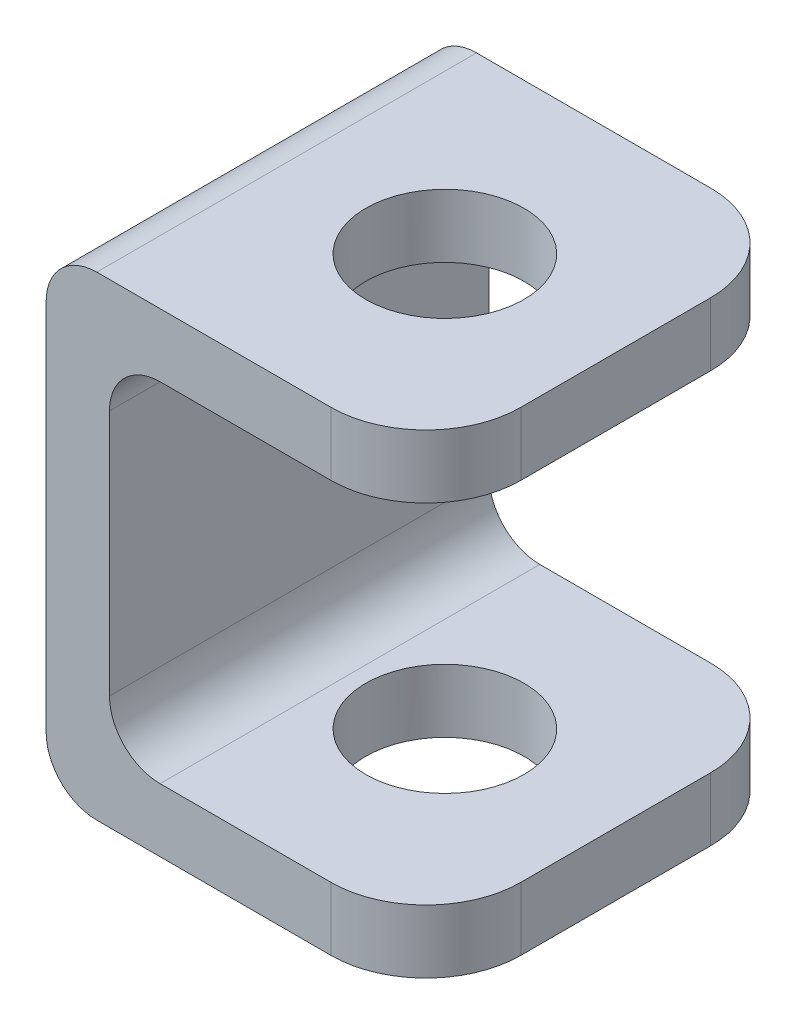
ISO-10303-21;
HEADER;
FILE_DESCRIPTION(('STEP AP214'),'2;1');
FILE_NAME('part.step','',(''),(''),'','','');
FILE_SCHEMA(('AUTOMOTIVE_DESIGN { 1 0 10303 214 1 1 1 1 }'));
ENDSEC;
DATA;
#1=APPLICATION_CONTEXT('core data for automotive mechanical design processes');
#2=APPLICATION_PROTOCOL_DEFINITION('international standard','automotive_design',2000,#1);
#3=PRODUCT_CONTEXT('',#1,'mechanical');
#4=PRODUCT('Part','Part','',(#3));
#5=PRODUCT_RELATED_PRODUCT_CATEGORY('part','',(#4));
#6=PRODUCT_DEFINITION_FORMATION('','',#4);
#7=PRODUCT_DEFINITION_CONTEXT('part definition',#1,'design');
#8=PRODUCT_DEFINITION('design','',#6,#7);
#9=PRODUCT_DEFINITION_SHAPE('','',#8);
#10=(LENGTH_UNIT() NAMED_UNIT(*) SI_UNIT(.MILLI.,.METRE.));
#11=(NAMED_UNIT(*) PLANE_ANGLE_UNIT() SI_UNIT($,.RADIAN.));
#12=(NAMED_UNIT(*) SI_UNIT($,.STERADIAN.) SOLID_ANGLE_UNIT());
#13=UNCERTAINTY_MEASURE_WITH_UNIT(LENGTH_MEASURE(1.E-05),#10,'distance_accuracy_value','');
#14=(GEOMETRIC_REPRESENTATION_CONTEXT(3) GLOBAL_UNCERTAINTY_ASSIGNED_CONTEXT((#13)) GLOBAL_UNIT_ASSIGNED_CONTEXT((#10,
#11,#12)) REPRESENTATION_CONTEXT('',''));
#15=CARTESIAN_POINT('',(0.,0.,0.));
#16=DIRECTION('',(0.,0.,1.));
#17=DIRECTION('',(1.,0.,0.));
#18=AXIS2_PLACEMENT_3D('',#15,#16,#17);
#19=CARTESIAN_POINT('',(0.,37.5,60.));
#20=DIRECTION('',(0.,-1.,0.));
#21=DIRECTION('',(0.,0.,-1.));
#22=AXIS2_PLACEMENT_3D('',#19,#20,#21);
#23=PLANE('',#22);
#24=CARTESIAN_POINT('',(33.,37.5,30.));
#25=DIRECTION('',(0.,1.,0.));
#26=DIRECTION('',(0.,0.,1.));
#27=AXIS2_PLACEMENT_3D('',#24,#25,#26);
#28=CIRCLE('',#27,12.5);
#29=CARTESIAN_POINT('',(33.,37.5,42.5));
#30=VERTEX_POINT('',#29);
#31=EDGE_CURVE('E223',#30,#30,#28,.T.);
#32=ORIENTED_EDGE('',*,*,#31,.F.);
#33=EDGE_LOOP('',(#32));
#34=FACE_BOUND('',#33,.T.);
#35=DIRECTION('',(-1.,0.,0.));
#36=VECTOR('',#35,1.);
#37=CARTESIAN_POINT('',(0.,37.5,0.));
#38=LINE('',#37,#36);
#39=CARTESIAN_POINT('',(45.,37.5,0.));
#40=VERTEX_POINT('',#39);
#41=CARTESIAN_POINT('',(8.,37.5,0.));
#42=VERTEX_POINT('',#41);
#43=EDGE_CURVE('E240',#40,#42,#38,.T.);
#44=ORIENTED_EDGE('',*,*,#43,.T.);
#45=DIRECTION('',(0.,0.,-1.));
#46=VECTOR('',#45,1.);
#47=CARTESIAN_POINT('',(8.,37.5,60.));
#48=LINE('',#47,#46);
#49=CARTESIAN_POINT('',(8.,37.5,60.));
#50=VERTEX_POINT('',#49);
#51=EDGE_CURVE('E63',#42,#50,#48,.F.);
#52=ORIENTED_EDGE('',*,*,#51,.T.);
#53=DIRECTION('',(-1.,0.,0.));
#54=VECTOR('',#53,1.);
#55=CARTESIAN_POINT('',(0.,37.5,60.));
#56=LINE('',#55,#54);
#57=CARTESIAN_POINT('',(45.,37.5,60.));
#58=VERTEX_POINT('',#57);
#59=EDGE_CURVE('E241',#58,#50,#56,.T.);
#60=ORIENTED_EDGE('',*,*,#59,.F.);
#61=CARTESIAN_POINT('',(45.,37.5,45.));
#62=DIRECTION('',(0.,-1.,0.));
#63=DIRECTION('',(0.,0.,-1.));
#64=AXIS2_PLACEMENT_3D('',#61,#62,#63);
#65=CIRCLE('',#64,15.);
#66=CARTESIAN_POINT('',(60.,37.5,45.));
#67=VERTEX_POINT('',#66);
#68=EDGE_CURVE('E341',#58,#67,#65,.F.);
#69=ORIENTED_EDGE('',*,*,#68,.T.);
#70=DIRECTION('',(0.,0.,-1.));
#71=VECTOR('',#70,1.);
#72=CARTESIAN_POINT('',(60.,37.5,60.));
#73=LINE('',#72,#71);
#74=CARTESIAN_POINT('',(60.,37.5,15.));
#75=VERTEX_POINT('',#74);
#76=EDGE_CURVE('E263',#67,#75,#73,.T.);
#77=ORIENTED_EDGE('',*,*,#76,.T.);
#78=CARTESIAN_POINT('',(45.,37.5,15.));
#79=DIRECTION('',(0.,-1.,0.));
#80=DIRECTION('',(0.,0.,-1.));
#81=AXIS2_PLACEMENT_3D('',#78,#79,#80);
#82=CIRCLE('',#81,15.);
#83=EDGE_CURVE('E344',#75,#40,#82,.F.);
#84=ORIENTED_EDGE('',*,*,#83,.T.);
#85=EDGE_LOOP('',(#44,#52,#60,#69,#77,#84));
#86=FACE_BOUND('',#85,.T.);
#87=ADVANCED_FACE('F38',(#34,#86),#23,.F.);
#88=CARTESIAN_POINT('',(0.,-37.5,60.));
#89=DIRECTION('',(1.,0.,0.));
#90=DIRECTION('',(0.,0.,-1.));
#91=AXIS2_PLACEMENT_3D('',#88,#89,#90);
#92=PLANE('',#91);
#93=DIRECTION('',(0.,0.,-1.));
#94=VECTOR('',#93,1.);
#95=CARTESIAN_POINT('',(0.,12.7,17.3));
#96=LINE('',#95,#94);
#97=CARTESIAN_POINT('',(0.,12.7,42.7));
#98=VERTEX_POINT('',#97);
#99=CARTESIAN_POINT('',(0.,12.7,17.3));
#100=VERTEX_POINT('',#99);
#101=EDGE_CURVE('E214',#98,#100,#96,.T.);
#102=ORIENTED_EDGE('',*,*,#101,.F.);
#103=DIRECTION('',(0.,1.,0.));
#104=VECTOR('',#103,1.);
#105=CARTESIAN_POINT('',(0.,12.7,42.7));
#106=LINE('',#105,#104);
#107=CARTESIAN_POINT('',(0.,-12.7,42.7));
#108=VERTEX_POINT('',#107);
#109=EDGE_CURVE('E55',#108,#98,#106,.T.);
#110=ORIENTED_EDGE('',*,*,#109,.F.);
#111=DIRECTION('',(0.,0.,1.));
#112=VECTOR('',#111,1.);
#113=CARTESIAN_POINT('',(0.,-12.7,17.3));
#114=LINE('',#113,#112);
#115=CARTESIAN_POINT('',(0.,-12.7,17.3));
#116=VERTEX_POINT('',#115);
#117=EDGE_CURVE('E201',#116,#108,#114,.T.);
#118=ORIENTED_EDGE('',*,*,#117,.F.);
#119=DIRECTION('',(0.,-1.,0.));
#120=VECTOR('',#119,1.);
#121=CARTESIAN_POINT('',(0.,12.7,17.3));
#122=LINE('',#121,#120);
#123=EDGE_CURVE('E205',#100,#116,#122,.T.);
#124=ORIENTED_EDGE('',*,*,#123,.F.);
#125=EDGE_LOOP('',(#102,#110,#118,#124));
#126=FACE_BOUND('',#125,.T.);
#127=DIRECTION('',(0.,-1.,0.));
#128=VECTOR('',#127,1.);
#129=CARTESIAN_POINT('',(0.,-37.5,0.));
#130=LINE('',#129,#128);
#131=CARTESIAN_POINT('',(0.,29.5,0.));
#132=VERTEX_POINT('',#131);
#133=CARTESIAN_POINT('',(0.,-29.5,0.));
#134=VERTEX_POINT('',#133);
#135=EDGE_CURVE('E266',#132,#134,#130,.T.);
#136=ORIENTED_EDGE('',*,*,#135,.T.);
#137=DIRECTION('',(0.,0.,-1.));
#138=VECTOR('',#137,1.);
#139=CARTESIAN_POINT('',(0.,-29.5,60.));
#140=LINE('',#139,#138);
#141=CARTESIAN_POINT('',(0.,-29.5,60.));
#142=VERTEX_POINT('',#141);
#143=EDGE_CURVE('E382',#134,#142,#140,.F.);
#144=ORIENTED_EDGE('',*,*,#143,.T.);
#145=DIRECTION('',(0.,-1.,0.));
#146=VECTOR('',#145,1.);
#147=CARTESIAN_POINT('',(0.,-37.5,60.));
#148=LINE('',#147,#146);
#149=CARTESIAN_POINT('',(0.,29.5,60.));
#150=VERTEX_POINT('',#149);
#151=EDGE_CURVE('E244',#150,#142,#148,.T.);
#152=ORIENTED_EDGE('',*,*,#151,.F.);
#153=DIRECTION('',(0.,0.,-1.));
#154=VECTOR('',#153,1.);
#155=CARTESIAN_POINT('',(0.,29.5,60.));
#156=LINE('',#155,#154);
#157=EDGE_CURVE('E378',#150,#132,#156,.T.);
#158=ORIENTED_EDGE('',*,*,#157,.T.);
#159=EDGE_LOOP('',(#136,#144,#152,#158));
#160=FACE_BOUND('',#159,.T.);
#161=ADVANCED_FACE('F449',(#126,#160),#92,.F.);
#162=CARTESIAN_POINT('',(0.,-37.5,60.));
#163=DIRECTION('',(0.,1.,0.));
#164=DIRECTION('',(0.,0.,1.));
#165=AXIS2_PLACEMENT_3D('',#162,#163,#164);
#166=PLANE('',#165);
#167=CARTESIAN_POINT('',(33.,-37.5,30.));
#168=DIRECTION('',(0.,1.,0.));
#169=DIRECTION('',(0.,0.,1.));
#170=AXIS2_PLACEMENT_3D('',#167,#168,#169);
#171=CIRCLE('',#170,12.5);
#172=CARTESIAN_POINT('',(33.,-37.5,42.5));
#173=VERTEX_POINT('',#172);
#174=EDGE_CURVE('E236',#173,#173,#171,.T.);
#175=ORIENTED_EDGE('',*,*,#174,.T.);
#176=EDGE_LOOP('',(#175));
#177=FACE_BOUND('',#176,.T.);
#178=DIRECTION('',(1.,0.,0.));
#179=VECTOR('',#178,1.);
#180=CARTESIAN_POINT('',(0.,-37.5,60.));
#181=LINE('',#180,#179);
#182=CARTESIAN_POINT('',(8.,-37.5,60.));
#183=VERTEX_POINT('',#182);
#184=CARTESIAN_POINT('',(45.,-37.5,60.));
#185=VERTEX_POINT('',#184);
#186=EDGE_CURVE('E249',#183,#185,#181,.T.);
#187=ORIENTED_EDGE('',*,*,#186,.F.);
#188=DIRECTION('',(0.,0.,-1.));
#189=VECTOR('',#188,1.);
#190=CARTESIAN_POINT('',(8.,-37.5,60.));
#191=LINE('',#190,#189);
#192=CARTESIAN_POINT('',(8.,-37.5,0.));
#193=VERTEX_POINT('',#192);
#194=EDGE_CURVE('E368',#183,#193,#191,.T.);
#195=ORIENTED_EDGE('',*,*,#194,.T.);
#196=DIRECTION('',(1.,0.,0.));
#197=VECTOR('',#196,1.);
#198=CARTESIAN_POINT('',(0.,-37.5,0.));
#199=LINE('',#198,#197);
#200=CARTESIAN_POINT('',(45.,-37.5,0.));
#201=VERTEX_POINT('',#200);
#202=EDGE_CURVE('E270',#193,#201,#199,.T.);
#203=ORIENTED_EDGE('',*,*,#202,.T.);
#204=CARTESIAN_POINT('',(45.,-37.5,15.));
#205=DIRECTION('',(0.,1.,0.));
#206=DIRECTION('',(0.,0.,1.));
#207=AXIS2_PLACEMENT_3D('',#204,#205,#206);
#208=CIRCLE('',#207,15.);
#209=CARTESIAN_POINT('',(60.,-37.5,15.));
#210=VERTEX_POINT('',#209);
#211=EDGE_CURVE('E319',#201,#210,#208,.F.);
#212=ORIENTED_EDGE('',*,*,#211,.T.);
#213=DIRECTION('',(0.,0.,-1.));
#214=VECTOR('',#213,1.);
#215=CARTESIAN_POINT('',(60.,-37.5,60.));
#216=LINE('',#215,#214);
#217=CARTESIAN_POINT('',(60.,-37.5,45.));
#218=VERTEX_POINT('',#217);
#219=EDGE_CURVE('E294',#218,#210,#216,.T.);
#220=ORIENTED_EDGE('',*,*,#219,.F.);
#221=CARTESIAN_POINT('',(45.,-37.5,45.));
#222=DIRECTION('',(0.,1.,0.));
#223=DIRECTION('',(0.,0.,1.));
#224=AXIS2_PLACEMENT_3D('',#221,#222,#223);
#225=CIRCLE('',#224,15.);
#226=EDGE_CURVE('E322',#218,#185,#225,.F.);
#227=ORIENTED_EDGE('',*,*,#226,.T.);
#228=EDGE_LOOP('',(#187,#195,#203,#212,#220,#227));
#229=FACE_BOUND('',#228,.T.);
#230=ADVANCED_FACE('F457',(#177,#229),#166,.F.);
#231=CARTESIAN_POINT('',(60.,-37.5,60.));
#232=DIRECTION('',(-1.,0.,0.));
#233=DIRECTION('',(0.,-1.,0.));
#234=AXIS2_PLACEMENT_3D('',#231,#232,#233);
#235=PLANE('',#234);
#236=DIRECTION('',(0.,0.,-1.));
#237=VECTOR('',#236,1.);
#238=CARTESIAN_POINT('',(60.,-27.5,60.));
#239=LINE('',#238,#237);
#240=CARTESIAN_POINT('',(60.,-27.5,45.));
#241=VERTEX_POINT('',#240);
#242=CARTESIAN_POINT('',(60.,-27.5,15.));
#243=VERTEX_POINT('',#242);
#244=EDGE_CURVE('E290',#241,#243,#239,.T.);
#245=ORIENTED_EDGE('',*,*,#244,.F.);
#246=DIRECTION('',(0.,1.,0.));
#247=VECTOR('',#246,1.);
#248=CARTESIAN_POINT('',(60.,-37.5,45.));
#249=LINE('',#248,#247);
#250=EDGE_CURVE('E316',#241,#218,#249,.F.);
#251=ORIENTED_EDGE('',*,*,#250,.T.);
#252=ORIENTED_EDGE('',*,*,#219,.T.);
#253=DIRECTION('',(0.,1.,0.));
#254=VECTOR('',#253,1.);
#255=CARTESIAN_POINT('',(60.,-27.5,15.));
#256=LINE('',#255,#254);
#257=EDGE_CURVE('E312',#210,#243,#256,.T.);
#258=ORIENTED_EDGE('',*,*,#257,.T.);
#259=EDGE_LOOP('',(#245,#251,#252,#258));
#260=FACE_BOUND('',#259,.T.);
#261=ADVANCED_FACE('F466',(#260),#235,.F.);
#262=CARTESIAN_POINT('',(60.,-27.5,60.));
#263=DIRECTION('',(0.,-1.,0.));
#264=DIRECTION('',(1.,0.,0.));
#265=AXIS2_PLACEMENT_3D('',#262,#263,#264);
#266=PLANE('',#265);
#267=CARTESIAN_POINT('',(33.,-27.5,30.));
#268=DIRECTION('',(0.,-1.,0.));
#269=DIRECTION('',(1.,0.,0.));
#270=AXIS2_PLACEMENT_3D('',#267,#268,#269);
#271=CIRCLE('',#270,12.5);
#272=CARTESIAN_POINT('',(45.5,-27.5,30.));
#273=VERTEX_POINT('',#272);
#274=EDGE_CURVE('E232',#273,#273,#271,.T.);
#275=ORIENTED_EDGE('',*,*,#274,.T.);
#276=EDGE_LOOP('',(#275));
#277=FACE_BOUND('',#276,.T.);
#278=DIRECTION('',(-1.,0.,0.));
#279=VECTOR('',#278,1.);
#280=CARTESIAN_POINT('',(60.,-27.5,0.));
#281=LINE('',#280,#279);
#282=CARTESIAN_POINT('',(45.,-27.5,0.));
#283=VERTEX_POINT('',#282);
#284=CARTESIAN_POINT('',(18.,-27.5,0.));
#285=VERTEX_POINT('',#284);
#286=EDGE_CURVE('E273',#283,#285,#281,.T.);
#287=ORIENTED_EDGE('',*,*,#286,.T.);
#288=DIRECTION('',(0.,0.,-1.));
#289=VECTOR('',#288,1.);
#290=CARTESIAN_POINT('',(18.,-27.5,60.));
#291=LINE('',#290,#289);
#292=CARTESIAN_POINT('',(18.,-27.5,60.));
#293=VERTEX_POINT('',#292);
#294=EDGE_CURVE('E365',#285,#293,#291,.F.);
#295=ORIENTED_EDGE('',*,*,#294,.T.);
#296=DIRECTION('',(-1.,0.,0.));
#297=VECTOR('',#296,1.);
#298=CARTESIAN_POINT('',(60.,-27.5,60.));
#299=LINE('',#298,#297);
#300=CARTESIAN_POINT('',(45.,-27.5,60.));
#301=VERTEX_POINT('',#300);
#302=EDGE_CURVE('E252',#301,#293,#299,.T.);
#303=ORIENTED_EDGE('',*,*,#302,.F.);
#304=CARTESIAN_POINT('',(45.,-27.5,45.));
#305=DIRECTION('',(0.,-1.,0.));
#306=DIRECTION('',(1.,0.,0.));
#307=AXIS2_PLACEMENT_3D('',#304,#305,#306);
#308=CIRCLE('',#307,15.);
#309=EDGE_CURVE('E309',#301,#241,#308,.F.);
#310=ORIENTED_EDGE('',*,*,#309,.T.);
#311=ORIENTED_EDGE('',*,*,#244,.T.);
#312=CARTESIAN_POINT('',(45.,-27.5,15.));
#313=DIRECTION('',(0.,-1.,0.));
#314=DIRECTION('',(1.,0.,0.));
#315=AXIS2_PLACEMENT_3D('',#312,#313,#314);
#316=CIRCLE('',#315,15.);
#317=EDGE_CURVE('E306',#243,#283,#316,.F.);
#318=ORIENTED_EDGE('',*,*,#317,.T.);
#319=EDGE_LOOP('',(#287,#295,#303,#310,#311,#318));
#320=FACE_BOUND('',#319,.T.);
#321=ADVANCED_FACE('F410',(#277,#320),#266,.F.);
#322=CARTESIAN_POINT('',(10.,27.5,60.));
#323=DIRECTION('',(-1.,0.,0.));
#324=DIRECTION('',(0.,0.,1.));
#325=AXIS2_PLACEMENT_3D('',#322,#323,#324);
#326=PLANE('',#325);
#327=DIRECTION('',(0.,1.,0.));
#328=VECTOR('',#327,1.);
#329=CARTESIAN_POINT('',(10.,27.5,0.));
#330=LINE('',#329,#328);
#331=CARTESIAN_POINT('',(10.,-19.5,0.));
#332=VERTEX_POINT('',#331);
#333=CARTESIAN_POINT('',(10.,19.5,0.));
#334=VERTEX_POINT('',#333);
#335=EDGE_CURVE('E277',#332,#334,#330,.T.);
#336=ORIENTED_EDGE('',*,*,#335,.T.);
#337=DIRECTION('',(0.,0.,-1.));
#338=VECTOR('',#337,1.);
#339=CARTESIAN_POINT('',(10.,19.5,60.));
#340=LINE('',#339,#338);
#341=CARTESIAN_POINT('',(10.,19.5,60.));
#342=VERTEX_POINT('',#341);
#343=EDGE_CURVE('E362',#334,#342,#340,.F.);
#344=ORIENTED_EDGE('',*,*,#343,.T.);
#345=DIRECTION('',(0.,1.,0.));
#346=VECTOR('',#345,1.);
#347=CARTESIAN_POINT('',(10.,27.5,60.));
#348=LINE('',#347,#346);
#349=CARTESIAN_POINT('',(10.,-19.5,60.));
#350=VERTEX_POINT('',#349);
#351=EDGE_CURVE('E256',#350,#342,#348,.T.);
#352=ORIENTED_EDGE('',*,*,#351,.F.);
#353=DIRECTION('',(0.,0.,-1.));
#354=VECTOR('',#353,1.);
#355=CARTESIAN_POINT('',(10.,-19.5,0.));
#356=LINE('',#355,#354);
#357=EDGE_CURVE('E358',#350,#332,#356,.T.);
#358=ORIENTED_EDGE('',*,*,#357,.T.);
#359=EDGE_LOOP('',(#336,#344,#352,#358));
#360=FACE_BOUND('',#359,.T.);
#361=ADVANCED_FACE('F419',(#360),#326,.F.);
#362=CARTESIAN_POINT('',(60.,27.5,60.));
#363=DIRECTION('',(0.,1.,0.));
#364=DIRECTION('',(-1.,0.,0.));
#365=AXIS2_PLACEMENT_3D('',#362,#363,#364);
#366=PLANE('',#365);
#367=CARTESIAN_POINT('',(33.,27.5,30.));
#368=DIRECTION('',(0.,1.,0.));
#369=DIRECTION('',(-1.,0.,0.));
#370=AXIS2_PLACEMENT_3D('',#367,#368,#369);
#371=CIRCLE('',#370,12.5);
#372=CARTESIAN_POINT('',(20.5,27.5,30.));
#373=VERTEX_POINT('',#372);
#374=EDGE_CURVE('E42',#373,#373,#371,.T.);
#375=ORIENTED_EDGE('',*,*,#374,.T.);
#376=EDGE_LOOP('',(#375));
#377=FACE_BOUND('',#376,.T.);
#378=DIRECTION('',(1.,0.,0.));
#379=VECTOR('',#378,1.);
#380=CARTESIAN_POINT('',(60.,27.5,60.));
#381=LINE('',#380,#379);
#382=CARTESIAN_POINT('',(18.,27.5,60.));
#383=VERTEX_POINT('',#382);
#384=CARTESIAN_POINT('',(45.,27.5,60.));
#385=VERTEX_POINT('',#384);
#386=EDGE_CURVE('E260',#383,#385,#381,.T.);
#387=ORIENTED_EDGE('',*,*,#386,.F.);
#388=DIRECTION('',(0.,0.,-1.));
#389=VECTOR('',#388,1.);
#390=CARTESIAN_POINT('',(18.,27.5,0.));
#391=LINE('',#390,#389);
#392=CARTESIAN_POINT('',(18.,27.5,0.));
#393=VERTEX_POINT('',#392);
#394=EDGE_CURVE('E354',#383,#393,#391,.T.);
#395=ORIENTED_EDGE('',*,*,#394,.T.);
#396=DIRECTION('',(1.,0.,0.));
#397=VECTOR('',#396,1.);
#398=CARTESIAN_POINT('',(60.,27.5,0.));
#399=LINE('',#398,#397);
#400=CARTESIAN_POINT('',(45.,27.5,0.));
#401=VERTEX_POINT('',#400);
#402=EDGE_CURVE('E245',#393,#401,#399,.T.);
#403=ORIENTED_EDGE('',*,*,#402,.T.);
#404=CARTESIAN_POINT('',(45.,27.5,15.));
#405=DIRECTION('',(0.,1.,0.));
#406=DIRECTION('',(-1.,0.,0.));
#407=AXIS2_PLACEMENT_3D('',#404,#405,#406);
#408=CIRCLE('',#407,15.);
#409=CARTESIAN_POINT('',(60.,27.5,15.));
#410=VERTEX_POINT('',#409);
#411=EDGE_CURVE('E351',#401,#410,#408,.F.);
#412=ORIENTED_EDGE('',*,*,#411,.T.);
#413=DIRECTION('',(0.,0.,-1.));
#414=VECTOR('',#413,1.);
#415=CARTESIAN_POINT('',(60.,27.5,60.));
#416=LINE('',#415,#414);
#417=CARTESIAN_POINT('',(60.,27.5,45.));
#418=VERTEX_POINT('',#417);
#419=EDGE_CURVE('E286',#418,#410,#416,.T.);
#420=ORIENTED_EDGE('',*,*,#419,.F.);
#421=CARTESIAN_POINT('',(45.,27.5,45.));
#422=DIRECTION('',(0.,1.,0.));
#423=DIRECTION('',(-1.,0.,0.));
#424=AXIS2_PLACEMENT_3D('',#421,#422,#423);
#425=CIRCLE('',#424,15.);
#426=EDGE_CURVE('E347',#418,#385,#425,.F.);
#427=ORIENTED_EDGE('',*,*,#426,.T.);
#428=EDGE_LOOP('',(#387,#395,#403,#412,#420,#427));
#429=FACE_BOUND('',#428,.T.);
#430=ADVANCED_FACE('F426',(#377,#429),#366,.F.);
#431=CARTESIAN_POINT('',(60.,37.5,60.));
#432=DIRECTION('',(-1.,0.,0.));
#433=DIRECTION('',(0.,-1.,0.));
#434=AXIS2_PLACEMENT_3D('',#431,#432,#433);
#435=PLANE('',#434);
#436=ORIENTED_EDGE('',*,*,#419,.T.);
#437=DIRECTION('',(0.,1.,0.));
#438=VECTOR('',#437,1.);
#439=CARTESIAN_POINT('',(60.,37.5,15.));
#440=LINE('',#439,#438);
#441=EDGE_CURVE('E337',#410,#75,#440,.T.);
#442=ORIENTED_EDGE('',*,*,#441,.T.);
#443=ORIENTED_EDGE('',*,*,#76,.F.);
#444=DIRECTION('',(0.,1.,0.));
#445=VECTOR('',#444,1.);
#446=CARTESIAN_POINT('',(60.,37.5,45.));
#447=LINE('',#446,#445);
#448=EDGE_CURVE('E334',#67,#418,#447,.F.);
#449=ORIENTED_EDGE('',*,*,#448,.T.);
#450=EDGE_LOOP('',(#436,#442,#443,#449));
#451=FACE_BOUND('',#450,.T.);
#452=ADVANCED_FACE('F437',(#451),#435,.F.);
#453=CARTESIAN_POINT('',(0.,0.,60.));
#454=DIRECTION('',(0.,0.,-1.));
#455=DIRECTION('',(-1.,0.,0.));
#456=AXIS2_PLACEMENT_3D('',#453,#454,#455);
#457=PLANE('',#456);
#458=ORIENTED_EDGE('',*,*,#151,.T.);
#459=CARTESIAN_POINT('',(8.,-29.5,60.));
#460=DIRECTION('',(0.,0.,-1.));
#461=DIRECTION('',(-1.,0.,0.));
#462=AXIS2_PLACEMENT_3D('',#459,#460,#461);
#463=CIRCLE('',#462,8.);
#464=EDGE_CURVE('E388',#142,#183,#463,.F.);
#465=ORIENTED_EDGE('',*,*,#464,.T.);
#466=ORIENTED_EDGE('',*,*,#186,.T.);
#467=DIRECTION('',(0.,1.,0.));
#468=VECTOR('',#467,1.);
#469=CARTESIAN_POINT('',(45.,0.,60.));
#470=LINE('',#469,#468);
#471=EDGE_CURVE('E302',#185,#301,#470,.T.);
#472=ORIENTED_EDGE('',*,*,#471,.T.);
#473=ORIENTED_EDGE('',*,*,#302,.T.);
#474=CARTESIAN_POINT('',(18.,-19.5,60.));
#475=DIRECTION('',(0.,0.,-1.));
#476=DIRECTION('',(-1.,0.,0.));
#477=AXIS2_PLACEMENT_3D('',#474,#475,#476);
#478=CIRCLE('',#477,8.);
#479=EDGE_CURVE('E11',#293,#350,#478,.T.);
#480=ORIENTED_EDGE('',*,*,#479,.T.);
#481=ORIENTED_EDGE('',*,*,#351,.T.);
#482=CARTESIAN_POINT('',(18.,19.5,60.));
#483=DIRECTION('',(0.,0.,-1.));
#484=DIRECTION('',(-1.,0.,0.));
#485=AXIS2_PLACEMENT_3D('',#482,#483,#484);
#486=CIRCLE('',#485,8.);
#487=EDGE_CURVE('E396',#342,#383,#486,.T.);
#488=ORIENTED_EDGE('',*,*,#487,.T.);
#489=ORIENTED_EDGE('',*,*,#386,.T.);
#490=DIRECTION('',(0.,1.,0.));
#491=VECTOR('',#490,1.);
#492=CARTESIAN_POINT('',(45.,0.,60.));
#493=LINE('',#492,#491);
#494=EDGE_CURVE('E298',#385,#58,#493,.T.);
#495=ORIENTED_EDGE('',*,*,#494,.T.);
#496=ORIENTED_EDGE('',*,*,#59,.T.);
#497=CARTESIAN_POINT('',(8.,29.5,60.));
#498=DIRECTION('',(0.,0.,-1.));
#499=DIRECTION('',(-1.,0.,0.));
#500=AXIS2_PLACEMENT_3D('',#497,#498,#499);
#501=CIRCLE('',#500,8.);
#502=EDGE_CURVE('E385',#50,#150,#501,.F.);
#503=ORIENTED_EDGE('',*,*,#502,.T.);
#504=EDGE_LOOP('',(#458,#465,#466,#472,#473,#480,#481,#488,#489,#495,#496,#503));
#505=FACE_BOUND('',#504,.T.);
#506=ADVANCED_FACE('F416',(#505),#457,.F.);
#507=CARTESIAN_POINT('',(0.,0.,0.));
#508=DIRECTION('',(0.,0.,-1.));
#509=DIRECTION('',(-1.,0.,0.));
#510=AXIS2_PLACEMENT_3D('',#507,#508,#509);
#511=PLANE('',#510);
#512=ORIENTED_EDGE('',*,*,#202,.F.);
#513=CARTESIAN_POINT('',(8.,-29.5,0.));
#514=DIRECTION('',(0.,0.,-1.));
#515=DIRECTION('',(-1.,0.,0.));
#516=AXIS2_PLACEMENT_3D('',#513,#514,#515);
#517=CIRCLE('',#516,8.);
#518=EDGE_CURVE('E375',#193,#134,#517,.T.);
#519=ORIENTED_EDGE('',*,*,#518,.T.);
#520=ORIENTED_EDGE('',*,*,#135,.F.);
#521=CARTESIAN_POINT('',(8.,29.5,0.));
#522=DIRECTION('',(0.,0.,-1.));
#523=DIRECTION('',(-1.,0.,0.));
#524=AXIS2_PLACEMENT_3D('',#521,#522,#523);
#525=CIRCLE('',#524,8.);
#526=EDGE_CURVE('E372',#132,#42,#525,.T.);
#527=ORIENTED_EDGE('',*,*,#526,.T.);
#528=ORIENTED_EDGE('',*,*,#43,.F.);
#529=DIRECTION('',(0.,1.,0.));
#530=VECTOR('',#529,1.);
#531=CARTESIAN_POINT('',(45.,27.5,0.));
#532=LINE('',#531,#530);
#533=EDGE_CURVE('E326',#40,#401,#532,.F.);
#534=ORIENTED_EDGE('',*,*,#533,.T.);
#535=ORIENTED_EDGE('',*,*,#402,.F.);
#536=CARTESIAN_POINT('',(18.,19.5,0.));
#537=DIRECTION('',(0.,0.,-1.));
#538=DIRECTION('',(-1.,0.,0.));
#539=AXIS2_PLACEMENT_3D('',#536,#537,#538);
#540=CIRCLE('',#539,8.);
#541=EDGE_CURVE('E393',#393,#334,#540,.F.);
#542=ORIENTED_EDGE('',*,*,#541,.T.);
#543=ORIENTED_EDGE('',*,*,#335,.F.);
#544=CARTESIAN_POINT('',(18.,-19.5,0.));
#545=DIRECTION('',(0.,0.,-1.));
#546=DIRECTION('',(-1.,0.,0.));
#547=AXIS2_PLACEMENT_3D('',#544,#545,#546);
#548=CIRCLE('',#547,8.);
#549=EDGE_CURVE('E48',#332,#285,#548,.F.);
#550=ORIENTED_EDGE('',*,*,#549,.T.);
#551=ORIENTED_EDGE('',*,*,#286,.F.);
#552=DIRECTION('',(0.,1.,0.));
#553=VECTOR('',#552,1.);
#554=CARTESIAN_POINT('',(45.,-37.5,0.));
#555=LINE('',#554,#553);
#556=EDGE_CURVE('E330',#283,#201,#555,.F.);
#557=ORIENTED_EDGE('',*,*,#556,.T.);
#558=EDGE_LOOP('',(#512,#519,#520,#527,#528,#534,#535,#542,#543,#550,#551,#557));
#559=FACE_BOUND('',#558,.T.);
#560=ADVANCED_FACE('F404',(#559),#511,.T.);
#561=CARTESIAN_POINT('',(45.,0.,45.));
#562=DIRECTION('',(0.,1.,0.));
#563=DIRECTION('',(-1.,0.,0.));
#564=AXIS2_PLACEMENT_3D('',#561,#562,#563);
#565=CYLINDRICAL_SURFACE('',#564,15.);
#566=ORIENTED_EDGE('',*,*,#226,.F.);
#567=ORIENTED_EDGE('',*,*,#250,.F.);
#568=ORIENTED_EDGE('',*,*,#309,.F.);
#569=ORIENTED_EDGE('',*,*,#471,.F.);
#570=EDGE_LOOP('',(#566,#567,#568,#569));
#571=FACE_BOUND('',#570,.T.);
#572=ADVANCED_FACE('F469',(#571),#565,.T.);
#573=CARTESIAN_POINT('',(45.,-37.5,15.));
#574=DIRECTION('',(0.,-1.,0.));
#575=DIRECTION('',(1.,0.,0.));
#576=AXIS2_PLACEMENT_3D('',#573,#574,#575);
#577=CYLINDRICAL_SURFACE('',#576,15.);
#578=ORIENTED_EDGE('',*,*,#211,.F.);
#579=ORIENTED_EDGE('',*,*,#556,.F.);
#580=ORIENTED_EDGE('',*,*,#317,.F.);
#581=ORIENTED_EDGE('',*,*,#257,.F.);
#582=EDGE_LOOP('',(#578,#579,#580,#581));
#583=FACE_BOUND('',#582,.T.);
#584=ADVANCED_FACE('F461',(#583),#577,.T.);
#585=CARTESIAN_POINT('',(45.,37.5,15.));
#586=DIRECTION('',(0.,-1.,0.));
#587=DIRECTION('',(1.,0.,0.));
#588=AXIS2_PLACEMENT_3D('',#585,#586,#587);
#589=CYLINDRICAL_SURFACE('',#588,15.);
#590=ORIENTED_EDGE('',*,*,#411,.F.);
#591=ORIENTED_EDGE('',*,*,#533,.F.);
#592=ORIENTED_EDGE('',*,*,#83,.F.);
#593=ORIENTED_EDGE('',*,*,#441,.F.);
#594=EDGE_LOOP('',(#590,#591,#592,#593));
#595=FACE_BOUND('',#594,.T.);
#596=ADVANCED_FACE('F441',(#595),#589,.T.);
#597=CARTESIAN_POINT('',(45.,0.,45.));
#598=DIRECTION('',(0.,1.,0.));
#599=DIRECTION('',(-1.,0.,0.));
#600=AXIS2_PLACEMENT_3D('',#597,#598,#599);
#601=CYLINDRICAL_SURFACE('',#600,15.);
#602=ORIENTED_EDGE('',*,*,#426,.F.);
#603=ORIENTED_EDGE('',*,*,#448,.F.);
#604=ORIENTED_EDGE('',*,*,#68,.F.);
#605=ORIENTED_EDGE('',*,*,#494,.F.);
#606=EDGE_LOOP('',(#602,#603,#604,#605));
#607=FACE_BOUND('',#606,.T.);
#608=ADVANCED_FACE('F433',(#607),#601,.T.);
#609=CARTESIAN_POINT('',(18.,19.5,60.));
#610=DIRECTION('',(0.,0.,1.));
#611=DIRECTION('',(1.,0.,0.));
#612=AXIS2_PLACEMENT_3D('',#609,#610,#611);
#613=CYLINDRICAL_SURFACE('',#612,8.);
#614=ORIENTED_EDGE('',*,*,#487,.F.);
#615=ORIENTED_EDGE('',*,*,#343,.F.);
#616=ORIENTED_EDGE('',*,*,#541,.F.);
#617=ORIENTED_EDGE('',*,*,#394,.F.);
#618=EDGE_LOOP('',(#614,#615,#616,#617));
#619=FACE_BOUND('',#618,.T.);
#620=ADVANCED_FACE('F422',(#619),#613,.F.);
#621=CARTESIAN_POINT('',(18.,-19.5,60.));
#622=DIRECTION('',(0.,0.,1.));
#623=DIRECTION('',(1.,0.,0.));
#624=AXIS2_PLACEMENT_3D('',#621,#622,#623);
#625=CYLINDRICAL_SURFACE('',#624,8.);
#626=ORIENTED_EDGE('',*,*,#479,.F.);
#627=ORIENTED_EDGE('',*,*,#294,.F.);
#628=ORIENTED_EDGE('',*,*,#549,.F.);
#629=ORIENTED_EDGE('',*,*,#357,.F.);
#630=EDGE_LOOP('',(#626,#627,#628,#629));
#631=FACE_BOUND('',#630,.T.);
#632=ADVANCED_FACE('F413',(#631),#625,.F.);
#633=CARTESIAN_POINT('',(8.,-29.5,60.));
#634=DIRECTION('',(0.,0.,-1.));
#635=DIRECTION('',(-1.,0.,0.));
#636=AXIS2_PLACEMENT_3D('',#633,#634,#635);
#637=CYLINDRICAL_SURFACE('',#636,8.);
#638=ORIENTED_EDGE('',*,*,#464,.F.);
#639=ORIENTED_EDGE('',*,*,#143,.F.);
#640=ORIENTED_EDGE('',*,*,#518,.F.);
#641=ORIENTED_EDGE('',*,*,#194,.F.);
#642=EDGE_LOOP('',(#638,#639,#640,#641));
#643=FACE_BOUND('',#642,.T.);
#644=ADVANCED_FACE('F455',(#643),#637,.T.);
#645=CARTESIAN_POINT('',(8.,29.5,60.));
#646=DIRECTION('',(0.,0.,-1.));
#647=DIRECTION('',(-1.,0.,0.));
#648=AXIS2_PLACEMENT_3D('',#645,#646,#647);
#649=CYLINDRICAL_SURFACE('',#648,8.);
#650=ORIENTED_EDGE('',*,*,#502,.F.);
#651=ORIENTED_EDGE('',*,*,#51,.F.);
#652=ORIENTED_EDGE('',*,*,#526,.F.);
#653=ORIENTED_EDGE('',*,*,#157,.F.);
#654=EDGE_LOOP('',(#650,#651,#652,#653));
#655=FACE_BOUND('',#654,.T.);
#656=ADVANCED_FACE('F40',(#655),#649,.T.);
#657=CARTESIAN_POINT('',(33.,-62.5,30.));
#658=DIRECTION('',(0.,1.,0.));
#659=DIRECTION('',(0.,0.,1.));
#660=AXIS2_PLACEMENT_3D('',#657,#658,#659);
#661=CYLINDRICAL_SURFACE('',#660,12.5);
#662=ORIENTED_EDGE('',*,*,#31,.T.);
#663=EDGE_LOOP('',(#662));
#664=FACE_BOUND('',#663,.T.);
#665=ORIENTED_EDGE('',*,*,#374,.F.);
#666=EDGE_LOOP('',(#665));
#667=FACE_BOUND('',#666,.T.);
#668=ADVANCED_FACE('F509',(#664,#667),#661,.F.);
#669=ORIENTED_EDGE('',*,*,#274,.F.);
#670=EDGE_LOOP('',(#669));
#671=FACE_BOUND('',#670,.T.);
#672=ORIENTED_EDGE('',*,*,#174,.F.);
#673=EDGE_LOOP('',(#672));
#674=FACE_BOUND('',#673,.T.);
#675=ADVANCED_FACE('F506',(#671,#674),#661,.F.);
#676=CARTESIAN_POINT('',(0.1,12.7,42.7));
#677=DIRECTION('',(0.,0.,1.));
#678=DIRECTION('',(0.,-1.,0.));
#679=AXIS2_PLACEMENT_3D('',#676,#677,#678);
#680=PLANE('',#679);
#681=ORIENTED_EDGE('',*,*,#109,.T.);
#682=DIRECTION('',(-1.,0.,0.));
#683=VECTOR('',#682,1.);
#684=CARTESIAN_POINT('',(0.1,12.7,42.7));
#685=LINE('',#684,#683);
#686=CARTESIAN_POINT('',(0.1,12.7,42.7));
#687=VERTEX_POINT('',#686);
#688=EDGE_CURVE('E176',#687,#98,#685,.T.);
#689=ORIENTED_EDGE('',*,*,#688,.F.);
#690=DIRECTION('',(0.,1.,0.));
#691=VECTOR('',#690,1.);
#692=CARTESIAN_POINT('',(0.1,12.7,42.7));
#693=LINE('',#692,#691);
#694=CARTESIAN_POINT('',(0.1,-12.7,42.7));
#695=VERTEX_POINT('',#694);
#696=EDGE_CURVE('E180',#695,#687,#693,.T.);
#697=ORIENTED_EDGE('',*,*,#696,.F.);
#698=DIRECTION('',(-1.,0.,0.));
#699=VECTOR('',#698,1.);
#700=CARTESIAN_POINT('',(0.1,-12.7,42.7));
#701=LINE('',#700,#699);
#702=EDGE_CURVE('E220',#695,#108,#701,.T.);
#703=ORIENTED_EDGE('',*,*,#702,.T.);
#704=EDGE_LOOP('',(#681,#689,#697,#703));
#705=FACE_BOUND('',#704,.T.);
#706=ADVANCED_FACE('F178',(#705),#680,.F.);
#707=CARTESIAN_POINT('',(0.1,-12.7,17.3));
#708=DIRECTION('',(0.,-1.,0.));
#709=DIRECTION('',(0.,0.,-1.));
#710=AXIS2_PLACEMENT_3D('',#707,#708,#709);
#711=PLANE('',#710);
#712=ORIENTED_EDGE('',*,*,#117,.T.);
#713=ORIENTED_EDGE('',*,*,#702,.F.);
#714=DIRECTION('',(0.,0.,1.));
#715=VECTOR('',#714,1.);
#716=CARTESIAN_POINT('',(0.1,-12.7,17.3));
#717=LINE('',#716,#715);
#718=CARTESIAN_POINT('',(0.1,-12.7,17.3));
#719=VERTEX_POINT('',#718);
#720=EDGE_CURVE('E187',#719,#695,#717,.T.);
#721=ORIENTED_EDGE('',*,*,#720,.F.);
#722=DIRECTION('',(-1.,0.,0.));
#723=VECTOR('',#722,1.);
#724=CARTESIAN_POINT('',(0.1,-12.7,17.3));
#725=LINE('',#724,#723);
#726=EDGE_CURVE('E224',#719,#116,#725,.T.);
#727=ORIENTED_EDGE('',*,*,#726,.T.);
#728=EDGE_LOOP('',(#712,#713,#721,#727));
#729=FACE_BOUND('',#728,.T.);
#730=ADVANCED_FACE('F513',(#729),#711,.F.);
#731=CARTESIAN_POINT('',(0.1,12.7,17.3));
#732=DIRECTION('',(0.,0.,-1.));
#733=DIRECTION('',(0.,1.,0.));
#734=AXIS2_PLACEMENT_3D('',#731,#732,#733);
#735=PLANE('',#734);
#736=ORIENTED_EDGE('',*,*,#123,.T.);
#737=ORIENTED_EDGE('',*,*,#726,.F.);
#738=DIRECTION('',(0.,-1.,0.));
#739=VECTOR('',#738,1.);
#740=CARTESIAN_POINT('',(0.1,12.7,17.3));
#741=LINE('',#740,#739);
#742=CARTESIAN_POINT('',(0.1,12.7,17.3));
#743=VERTEX_POINT('',#742);
#744=EDGE_CURVE('E196',#743,#719,#741,.T.);
#745=ORIENTED_EDGE('',*,*,#744,.F.);
#746=DIRECTION('',(-1.,0.,0.));
#747=VECTOR('',#746,1.);
#748=CARTESIAN_POINT('',(0.1,12.7,17.3));
#749=LINE('',#748,#747);
#750=EDGE_CURVE('E186',#743,#100,#749,.T.);
#751=ORIENTED_EDGE('',*,*,#750,.T.);
#752=EDGE_LOOP('',(#736,#737,#745,#751));
#753=FACE_BOUND('',#752,.T.);
#754=ADVANCED_FACE('F516',(#753),#735,.F.);
#755=CARTESIAN_POINT('',(0.1,12.7,17.3));
#756=DIRECTION('',(0.,1.,0.));
#757=DIRECTION('',(0.,0.,1.));
#758=AXIS2_PLACEMENT_3D('',#755,#756,#757);
#759=PLANE('',#758);
#760=ORIENTED_EDGE('',*,*,#101,.T.);
#761=ORIENTED_EDGE('',*,*,#750,.F.);
#762=DIRECTION('',(0.,0.,-1.));
#763=VECTOR('',#762,1.);
#764=CARTESIAN_POINT('',(0.1,12.7,17.3));
#765=LINE('',#764,#763);
#766=EDGE_CURVE('E190',#687,#743,#765,.T.);
#767=ORIENTED_EDGE('',*,*,#766,.F.);
#768=ORIENTED_EDGE('',*,*,#688,.T.);
#769=EDGE_LOOP('',(#760,#761,#767,#768));
#770=FACE_BOUND('',#769,.T.);
#771=ADVANCED_FACE('F191',(#770),#759,.F.);
#772=CARTESIAN_POINT('',(0.1,0.,0.));
#773=DIRECTION('',(-1.,0.,0.));
#774=DIRECTION('',(0.,0.,1.));
#775=AXIS2_PLACEMENT_3D('',#772,#773,#774);
#776=PLANE('',#775);
#777=ORIENTED_EDGE('',*,*,#696,.T.);
#778=ORIENTED_EDGE('',*,*,#766,.T.);
#779=ORIENTED_EDGE('',*,*,#744,.T.);
#780=ORIENTED_EDGE('',*,*,#720,.T.);
#781=EDGE_LOOP('',(#777,#778,#779,#780));
#782=FACE_BOUND('',#781,.T.);
#783=ADVANCED_FACE('F198',(#782),#776,.T.);
#784=CLOSED_SHELL('',(#87,#161,#230,#261,#321,#361,#430,#452,#506,#560,#572,#584,#596,#608,#620,
#632,#644,#656,#668,#675,#706,#730,#754,#771,#783));
#785=MANIFOLD_SOLID_BREP('B2',#784);
#786=ADVANCED_BREP_SHAPE_REPRESENTATION('',(#18,#785),#14);
#787=SHAPE_DEFINITION_REPRESENTATION(#9,#786);
ENDSEC;
END-ISO-10303-21;
